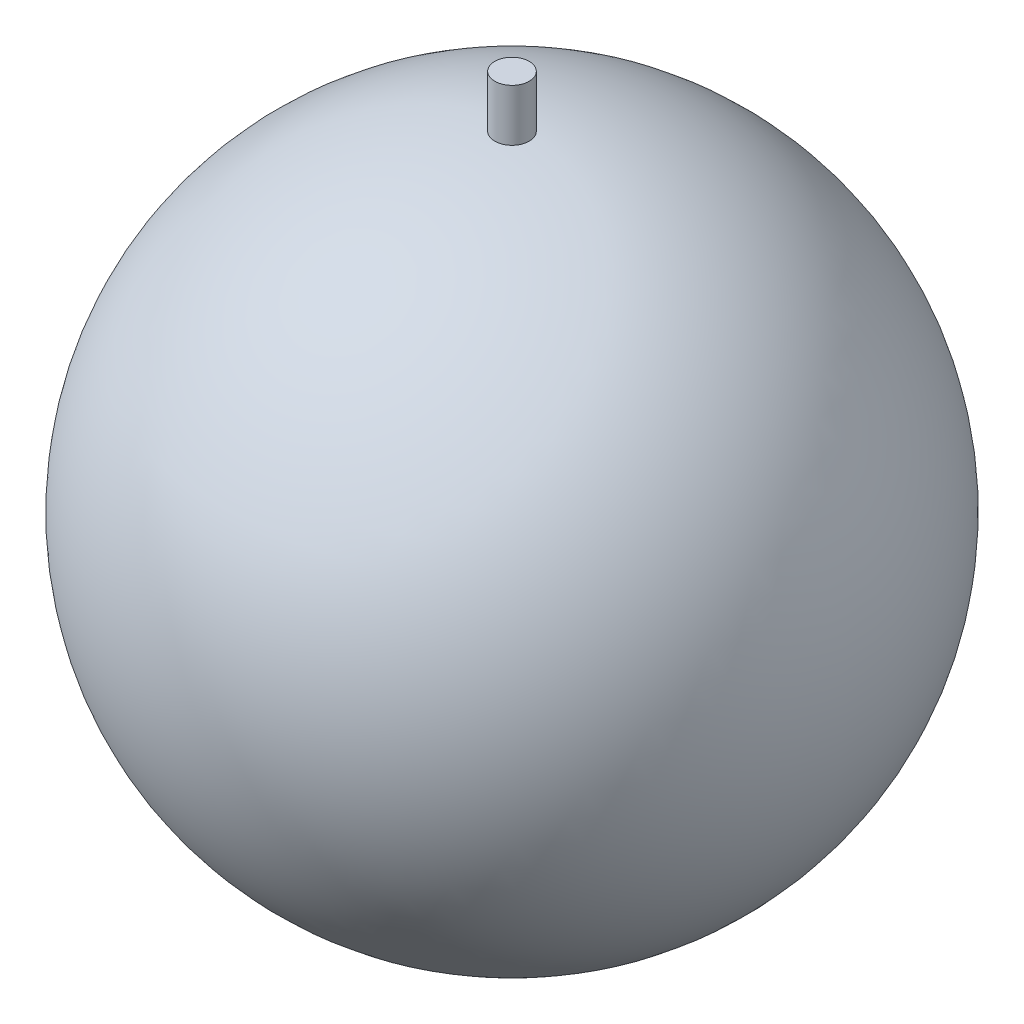
ISO-10303-21;
HEADER;
FILE_DESCRIPTION(('STEP AP214'),'2;1');
FILE_NAME('part.step','',(''),(''),'','','');
FILE_SCHEMA(('AUTOMOTIVE_DESIGN { 1 0 10303 214 1 1 1 1 }'));
ENDSEC;
DATA;
#1=APPLICATION_CONTEXT('core data for automotive mechanical design processes');
#2=APPLICATION_PROTOCOL_DEFINITION('international standard','automotive_design',2000,#1);
#3=PRODUCT_CONTEXT('',#1,'mechanical');
#4=PRODUCT('Part','Part','',(#3));
#5=PRODUCT_RELATED_PRODUCT_CATEGORY('part','',(#4));
#6=PRODUCT_DEFINITION_FORMATION('','',#4);
#7=PRODUCT_DEFINITION_CONTEXT('part definition',#1,'design');
#8=PRODUCT_DEFINITION('design','',#6,#7);
#9=PRODUCT_DEFINITION_SHAPE('','',#8);
#10=(LENGTH_UNIT() NAMED_UNIT(*) SI_UNIT(.MILLI.,.METRE.));
#11=(NAMED_UNIT(*) PLANE_ANGLE_UNIT() SI_UNIT($,.RADIAN.));
#12=(NAMED_UNIT(*) SI_UNIT($,.STERADIAN.) SOLID_ANGLE_UNIT());
#13=UNCERTAINTY_MEASURE_WITH_UNIT(LENGTH_MEASURE(1.E-05),#10,'distance_accuracy_value','');
#14=(GEOMETRIC_REPRESENTATION_CONTEXT(3) GLOBAL_UNCERTAINTY_ASSIGNED_CONTEXT((#13)) GLOBAL_UNIT_ASSIGNED_CONTEXT((#10,
#11,#12)) REPRESENTATION_CONTEXT('',''));
#15=CARTESIAN_POINT('',(0.,0.,0.));
#16=DIRECTION('',(0.,0.,1.));
#17=DIRECTION('',(1.,0.,0.));
#18=AXIS2_PLACEMENT_3D('',#15,#16,#17);
#19=CARTESIAN_POINT('',(14.5206825207382,60.1560642411381,0.));
#20=DIRECTION('',(0.,-1.,0.));
#21=DIRECTION('',(0.,0.,-1.));
#22=AXIS2_PLACEMENT_3D('',#19,#20,#21);
#23=CYLINDRICAL_SURFACE('',#22,1.6573111326663);
#24=CARTESIAN_POINT('',(14.5206825207382,60.1560642411381,0.));
#25=DIRECTION('',(0.,1.,0.));
#26=DIRECTION('',(0.,0.,1.));
#27=AXIS2_PLACEMENT_3D('',#24,#25,#26);
#28=CIRCLE('',#27,1.6573111326663);
#29=CARTESIAN_POINT('',(14.5206825207382,60.1560642411381,1.6573111326663));
#30=VERTEX_POINT('',#29);
#31=EDGE_CURVE('E11',#30,#30,#28,.T.);
#32=ORIENTED_EDGE('',*,*,#31,.F.);
#33=EDGE_LOOP('',(#32));
#34=FACE_BOUND('',#33,.T.);
#35=CARTESIAN_POINT('',(14.5206825207382,55.1560642411381,0.));
#36=DIRECTION('',(0.,1.,0.));
#37=DIRECTION('',(0.,0.,1.));
#38=AXIS2_PLACEMENT_3D('',#35,#36,#37);
#39=CIRCLE('',#38,1.6573111326663);
#40=CARTESIAN_POINT('',(14.5206825207382,55.1560642411381,1.6573111326663));
#41=VERTEX_POINT('',#40);
#42=EDGE_CURVE('E46',#41,#41,#39,.T.);
#43=ORIENTED_EDGE('',*,*,#42,.T.);
#44=EDGE_LOOP('',(#43));
#45=FACE_BOUND('',#44,.T.);
#46=ADVANCED_FACE('F43',(#34,#45),#23,.T.);
#47=CARTESIAN_POINT('',(14.5206825207382,60.1560642411381,0.));
#48=DIRECTION('',(0.,1.,0.));
#49=DIRECTION('',(0.,0.,1.));
#50=AXIS2_PLACEMENT_3D('',#47,#48,#49);
#51=PLANE('',#50);
#52=ORIENTED_EDGE('',*,*,#31,.T.);
#53=EDGE_LOOP('',(#52));
#54=FACE_BOUND('',#53,.T.);
#55=ADVANCED_FACE('F58',(#54),#51,.T.);
#56=CARTESIAN_POINT('',(14.5206825207382,55.1560642411381,0.));
#57=DIRECTION('',(0.,1.,0.));
#58=DIRECTION('',(0.,0.,1.));
#59=AXIS2_PLACEMENT_3D('',#56,#57,#58);
#60=PLANE('',#59);
#61=ORIENTED_EDGE('',*,*,#42,.F.);
#62=EDGE_LOOP('',(#61));
#63=FACE_BOUND('',#62,.T.);
#64=ADVANCED_FACE('F56',(#63),#60,.F.);
#65=CLOSED_SHELL('',(#46,#55,#64));
#66=MANIFOLD_SOLID_BREP('B2',#65);
#67=CARTESIAN_POINT('',(14.5206825207382,23.4155525683506,0.));
#68=DIRECTION('',(0.,1.,0.));
#69=DIRECTION('',(1.,0.,0.));
#70=AXIS2_PLACEMENT_3D('',#67,#68,#69);
#71=SPHERICAL_SURFACE('',#70,31.7405116727875);
#72=CARTESIAN_POINT('',(14.5206825207382,55.1560642411381,0.));
#73=VERTEX_POINT('',#72);
#74=VERTEX_LOOP('',#73);
#75=FACE_BOUND('',#74,.T.);
#76=ADVANCED_FACE('F84',(#75),#71,.T.);
#77=CLOSED_SHELL('',(#76));
#78=MANIFOLD_SOLID_BREP('B6',#77);
#79=ADVANCED_BREP_SHAPE_REPRESENTATION('',(#18,#66,#78),#14);
#80=SHAPE_DEFINITION_REPRESENTATION(#9,#79);
ENDSEC;
END-ISO-10303-21;
